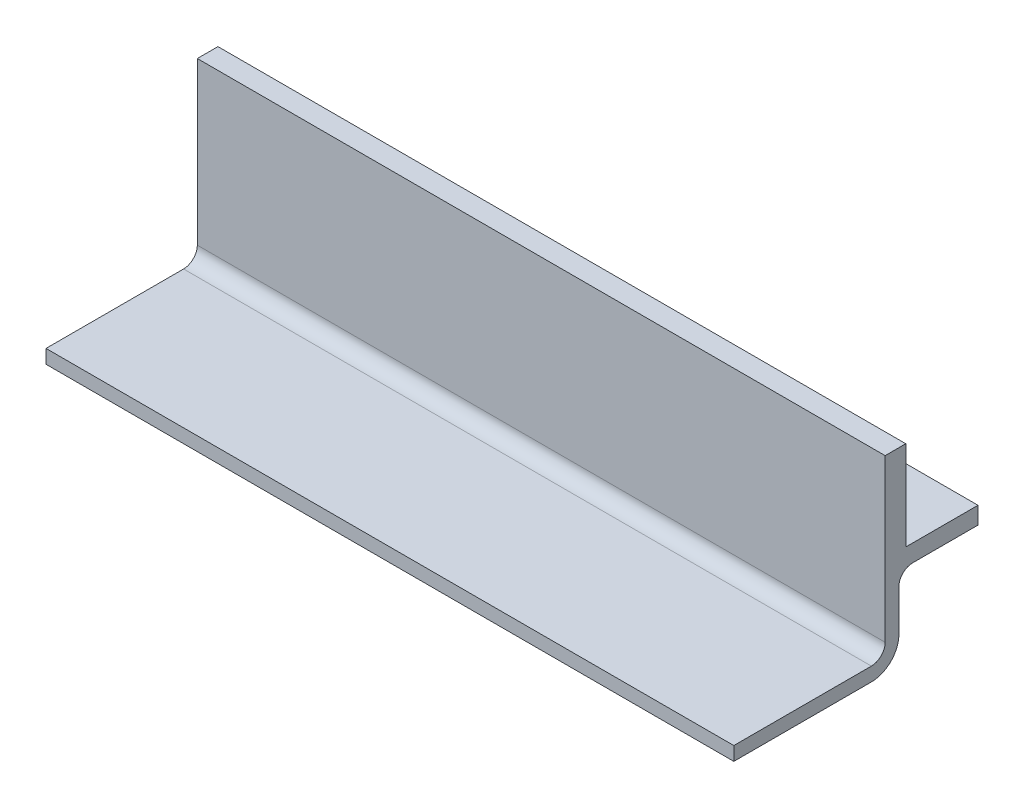
ISO-10303-21;
HEADER;
FILE_DESCRIPTION(('STEP AP214'),'2;1');
FILE_NAME('part.step','',(''),(''),'','','');
FILE_SCHEMA(('AUTOMOTIVE_DESIGN { 1 0 10303 214 1 1 1 1 }'));
ENDSEC;
DATA;
#1=APPLICATION_CONTEXT('core data for automotive mechanical design processes');
#2=APPLICATION_PROTOCOL_DEFINITION('international standard','automotive_design',2000,#1);
#3=PRODUCT_CONTEXT('',#1,'mechanical');
#4=PRODUCT('Part','Part','',(#3));
#5=PRODUCT_RELATED_PRODUCT_CATEGORY('part','',(#4));
#6=PRODUCT_DEFINITION_FORMATION('','',#4);
#7=PRODUCT_DEFINITION_CONTEXT('part definition',#1,'design');
#8=PRODUCT_DEFINITION('design','',#6,#7);
#9=PRODUCT_DEFINITION_SHAPE('','',#8);
#10=(LENGTH_UNIT() NAMED_UNIT(*) SI_UNIT(.MILLI.,.METRE.));
#11=(NAMED_UNIT(*) PLANE_ANGLE_UNIT() SI_UNIT($,.RADIAN.));
#12=(NAMED_UNIT(*) SI_UNIT($,.STERADIAN.) SOLID_ANGLE_UNIT());
#13=UNCERTAINTY_MEASURE_WITH_UNIT(LENGTH_MEASURE(1.E-05),#10,'distance_accuracy_value','');
#14=(GEOMETRIC_REPRESENTATION_CONTEXT(3) GLOBAL_UNCERTAINTY_ASSIGNED_CONTEXT((#13)) GLOBAL_UNIT_ASSIGNED_CONTEXT((#10,
#11,#12)) REPRESENTATION_CONTEXT('',''));
#15=CARTESIAN_POINT('',(0.,0.,0.));
#16=DIRECTION('',(0.,0.,1.));
#17=DIRECTION('',(1.,0.,0.));
#18=AXIS2_PLACEMENT_3D('',#15,#16,#17);
#19=CARTESIAN_POINT('',(100.,-17.2500001862645,16.7500000745058));
#20=DIRECTION('',(1.,0.,0.));
#21=DIRECTION('',(0.,1.,0.));
#22=AXIS2_PLACEMENT_3D('',#19,#20,#21);
#23=PLANE('',#22);
#24=CARTESIAN_POINT('',(100.,-33.0000003725291,25.5));
#25=DIRECTION('',(-1.,0.,0.));
#26=DIRECTION('',(0.,-0.707106781186547,-0.707106781186548));
#27=AXIS2_PLACEMENT_3D('',#24,#25,#26);
#28=CIRCLE('',#27,4.);
#29=CARTESIAN_POINT('',(100.,-33.000000372529,21.5));
#30=VERTEX_POINT('',#29);
#31=CARTESIAN_POINT('',(100.,-37.0000003725291,25.5));
#32=VERTEX_POINT('',#31);
#33=EDGE_CURVE('E188',#30,#32,#28,.T.);
#34=ORIENTED_EDGE('',*,*,#33,.F.);
#35=DIRECTION('',(0.,1.,0.));
#36=VECTOR('',#35,1.);
#37=CARTESIAN_POINT('',(100.,-37.0000003725291,21.5));
#38=LINE('',#37,#36);
#39=CARTESIAN_POINT('',(100.,-27.0000003725291,21.5));
#40=VERTEX_POINT('',#39);
#41=EDGE_CURVE('E183',#30,#40,#38,.T.);
#42=ORIENTED_EDGE('',*,*,#41,.T.);
#43=CARTESIAN_POINT('',(100.,-27.000000372529,19.5));
#44=DIRECTION('',(1.,0.,0.));
#45=DIRECTION('',(0.,0.707106781186546,0.707106781186549));
#46=AXIS2_PLACEMENT_3D('',#43,#44,#45);
#47=CIRCLE('',#46,2.);
#48=CARTESIAN_POINT('',(100.,-25.000000372529,19.5));
#49=VERTEX_POINT('',#48);
#50=EDGE_CURVE('E272',#49,#40,#47,.T.);
#51=ORIENTED_EDGE('',*,*,#50,.F.);
#52=DIRECTION('',(0.,0.,1.));
#53=VECTOR('',#52,1.);
#54=CARTESIAN_POINT('',(100.,-25.000000372529,10.0000001490116));
#55=LINE('',#54,#53);
#56=CARTESIAN_POINT('',(100.,-25.000000372529,10.0000001490116));
#57=VERTEX_POINT('',#56);
#58=EDGE_CURVE('E326',#57,#49,#55,.T.);
#59=ORIENTED_EDGE('',*,*,#58,.F.);
#60=DIRECTION('',(0.,-1.,0.));
#61=VECTOR('',#60,1.);
#62=CARTESIAN_POINT('',(100.,-22.5000000061548,10.0000001490116));
#63=LINE('',#62,#61);
#64=CARTESIAN_POINT('',(100.,-22.5000000061548,10.0000001490116));
#65=VERTEX_POINT('',#64);
#66=EDGE_CURVE('E260',#65,#57,#63,.T.);
#67=ORIENTED_EDGE('',*,*,#66,.F.);
#68=DIRECTION('',(0.,0.,1.));
#69=VECTOR('',#68,1.);
#70=CARTESIAN_POINT('',(100.,-22.5000000061548,10.0000001490116));
#71=LINE('',#70,#69);
#72=CARTESIAN_POINT('',(100.,-22.5000000061547,20.5));
#73=VERTEX_POINT('',#72);
#74=EDGE_CURVE('E346',#65,#73,#71,.T.);
#75=ORIENTED_EDGE('',*,*,#74,.T.);
#76=DIRECTION('',(0.,-1.,0.));
#77=VECTOR('',#76,1.);
#78=CARTESIAN_POINT('',(100.,-16.5000000707805,20.5));
#79=LINE('',#78,#77);
#80=CARTESIAN_POINT('',(100.,-9.5,20.5));
#81=VERTEX_POINT('',#80);
#82=EDGE_CURVE('E25',#81,#73,#79,.T.);
#83=ORIENTED_EDGE('',*,*,#82,.F.);
#84=DIRECTION('',(0.,0.,-1.));
#85=VECTOR('',#84,1.);
#86=CARTESIAN_POINT('',(100.,-9.5,23.5));
#87=LINE('',#86,#85);
#88=CARTESIAN_POINT('',(100.,-9.5,23.5));
#89=VERTEX_POINT('',#88);
#90=EDGE_CURVE('E11',#89,#81,#87,.T.);
#91=ORIENTED_EDGE('',*,*,#90,.F.);
#92=DIRECTION('',(0.,1.,0.));
#93=VECTOR('',#92,1.);
#94=CARTESIAN_POINT('',(100.,-25.000000372529,23.5));
#95=LINE('',#94,#93);
#96=CARTESIAN_POINT('',(100.,-33.0000003725291,23.5));
#97=VERTEX_POINT('',#96);
#98=EDGE_CURVE('E265',#97,#89,#95,.T.);
#99=ORIENTED_EDGE('',*,*,#98,.F.);
#100=CARTESIAN_POINT('',(100.,-33.0000003725291,25.5));
#101=DIRECTION('',(1.,0.,0.));
#102=DIRECTION('',(0.,-0.707106781186549,-0.707106781186546));
#103=AXIS2_PLACEMENT_3D('',#100,#101,#102);
#104=CIRCLE('',#103,2.);
#105=CARTESIAN_POINT('',(100.,-35.0000003725291,25.5));
#106=VERTEX_POINT('',#105);
#107=EDGE_CURVE('E288',#106,#97,#104,.T.);
#108=ORIENTED_EDGE('',*,*,#107,.F.);
#109=DIRECTION('',(0.,0.,1.));
#110=VECTOR('',#109,1.);
#111=CARTESIAN_POINT('',(100.,-35.0000003725291,23.5));
#112=LINE('',#111,#110);
#113=CARTESIAN_POINT('',(100.,-35.000000372529,45.5));
#114=VERTEX_POINT('',#113);
#115=EDGE_CURVE('E216',#106,#114,#112,.T.);
#116=ORIENTED_EDGE('',*,*,#115,.T.);
#117=DIRECTION('',(0.,-1.,0.));
#118=VECTOR('',#117,1.);
#119=CARTESIAN_POINT('',(100.,-35.000000372529,45.5));
#120=LINE('',#119,#118);
#121=CARTESIAN_POINT('',(100.,-37.000000372529,45.5));
#122=VERTEX_POINT('',#121);
#123=EDGE_CURVE('E213',#114,#122,#120,.T.);
#124=ORIENTED_EDGE('',*,*,#123,.T.);
#125=DIRECTION('',(0.,0.,-1.));
#126=VECTOR('',#125,1.);
#127=CARTESIAN_POINT('',(100.,-37.000000372529,45.5));
#128=LINE('',#127,#126);
#129=EDGE_CURVE('E178',#122,#32,#128,.T.);
#130=ORIENTED_EDGE('',*,*,#129,.T.);
#131=EDGE_LOOP('',(#34,#42,#51,#59,#67,#75,#83,#91,#99,#108,#116,#124,#130));
#132=FACE_BOUND('',#131,.T.);
#133=ADVANCED_FACE('F17',(#132),#23,.T.);
#134=CARTESIAN_POINT('',(100.,-9.5,23.5));
#135=DIRECTION('',(0.,1.,0.));
#136=DIRECTION('',(1.,0.,0.));
#137=AXIS2_PLACEMENT_3D('',#134,#135,#136);
#138=PLANE('',#137);
#139=DIRECTION('',(0.,0.,1.));
#140=VECTOR('',#139,1.);
#141=CARTESIAN_POINT('',(0.,-9.5,20.1250000372529));
#142=LINE('',#141,#140);
#143=CARTESIAN_POINT('',(0.,-9.5,20.5));
#144=VERTEX_POINT('',#143);
#145=CARTESIAN_POINT('',(0.,-9.5,23.5));
#146=VERTEX_POINT('',#145);
#147=EDGE_CURVE('E223',#144,#146,#142,.T.);
#148=ORIENTED_EDGE('',*,*,#147,.T.);
#149=DIRECTION('',(-1.,0.,0.));
#150=VECTOR('',#149,1.);
#151=CARTESIAN_POINT('',(100.,-9.5,23.5));
#152=LINE('',#151,#150);
#153=EDGE_CURVE('E303',#89,#146,#152,.T.);
#154=ORIENTED_EDGE('',*,*,#153,.F.);
#155=ORIENTED_EDGE('',*,*,#90,.T.);
#156=DIRECTION('',(-1.,0.,0.));
#157=VECTOR('',#156,1.);
#158=CARTESIAN_POINT('',(100.,-9.5,20.5));
#159=LINE('',#158,#157);
#160=EDGE_CURVE('E282',#81,#144,#159,.T.);
#161=ORIENTED_EDGE('',*,*,#160,.T.);
#162=EDGE_LOOP('',(#148,#154,#155,#161));
#163=FACE_BOUND('',#162,.T.);
#164=ADVANCED_FACE('F366',(#163),#138,.T.);
#165=CARTESIAN_POINT('',(100.,-9.5,20.5));
#166=DIRECTION('',(0.,0.,-1.));
#167=DIRECTION('',(-1.,0.,0.));
#168=AXIS2_PLACEMENT_3D('',#165,#166,#167);
#169=PLANE('',#168);
#170=DIRECTION('',(0.,1.,0.));
#171=VECTOR('',#170,1.);
#172=CARTESIAN_POINT('',(0.,-13.3750000931323,20.5));
#173=LINE('',#172,#171);
#174=CARTESIAN_POINT('',(0.,-22.5000000061547,20.5));
#175=VERTEX_POINT('',#174);
#176=EDGE_CURVE('E240',#175,#144,#173,.T.);
#177=ORIENTED_EDGE('',*,*,#176,.T.);
#178=ORIENTED_EDGE('',*,*,#160,.F.);
#179=ORIENTED_EDGE('',*,*,#82,.T.);
#180=DIRECTION('',(-1.,0.,0.));
#181=VECTOR('',#180,1.);
#182=CARTESIAN_POINT('',(100.,-22.5000000061547,20.5));
#183=LINE('',#182,#181);
#184=EDGE_CURVE('E306',#73,#175,#183,.T.);
#185=ORIENTED_EDGE('',*,*,#184,.T.);
#186=EDGE_LOOP('',(#177,#178,#179,#185));
#187=FACE_BOUND('',#186,.T.);
#188=ADVANCED_FACE('F362',(#187),#169,.T.);
#189=CARTESIAN_POINT('',(100.,-22.5000000061547,20.5));
#190=DIRECTION('',(0.,1.,0.));
#191=DIRECTION('',(0.,0.,-1.));
#192=AXIS2_PLACEMENT_3D('',#189,#190,#191);
#193=PLANE('',#192);
#194=CARTESIAN_POINT('',(85.,-22.5000000061547,14.5000000461613));
#195=DIRECTION('',(0.,-1.,0.));
#196=DIRECTION('',(1.,0.,0.));
#197=AXIS2_PLACEMENT_3D('',#194,#195,#196);
#198=CIRCLE('',#197,2.);
#199=CARTESIAN_POINT('',(83.,-22.5000000061548,14.5000000461613));
#200=VERTEX_POINT('',#199);
#201=EDGE_CURVE('E299',#200,#200,#198,.T.);
#202=ORIENTED_EDGE('',*,*,#201,.T.);
#203=EDGE_LOOP('',(#202));
#204=FACE_BOUND('',#203,.T.);
#205=CARTESIAN_POINT('',(15.,-22.5000000061547,14.5000000461613));
#206=DIRECTION('',(0.,-1.,0.));
#207=DIRECTION('',(1.,0.,0.));
#208=AXIS2_PLACEMENT_3D('',#205,#206,#207);
#209=CIRCLE('',#208,2.);
#210=CARTESIAN_POINT('',(13.,-22.5000000061548,14.5000000461613));
#211=VERTEX_POINT('',#210);
#212=EDGE_CURVE('E227',#211,#211,#209,.T.);
#213=ORIENTED_EDGE('',*,*,#212,.T.);
#214=EDGE_LOOP('',(#213));
#215=FACE_BOUND('',#214,.T.);
#216=DIRECTION('',(0.,0.,1.));
#217=VECTOR('',#216,1.);
#218=CARTESIAN_POINT('',(0.,-22.5000000061547,18.6250000372529));
#219=LINE('',#218,#217);
#220=CARTESIAN_POINT('',(0.,-22.5000000061548,10.0000001490116));
#221=VERTEX_POINT('',#220);
#222=EDGE_CURVE('E246',#221,#175,#219,.T.);
#223=ORIENTED_EDGE('',*,*,#222,.T.);
#224=ORIENTED_EDGE('',*,*,#184,.F.);
#225=ORIENTED_EDGE('',*,*,#74,.F.);
#226=DIRECTION('',(-1.,0.,0.));
#227=VECTOR('',#226,1.);
#228=CARTESIAN_POINT('',(100.,-22.5000000061548,10.0000001490116));
#229=LINE('',#228,#227);
#230=EDGE_CURVE('E230',#65,#221,#229,.T.);
#231=ORIENTED_EDGE('',*,*,#230,.T.);
#232=EDGE_LOOP('',(#223,#224,#225,#231));
#233=FACE_BOUND('',#232,.T.);
#234=ADVANCED_FACE('F359',(#204,#215,#233),#193,.T.);
#235=CARTESIAN_POINT('',(100.,-22.5000000061548,10.0000001490116));
#236=DIRECTION('',(0.,0.,-1.));
#237=DIRECTION('',(-1.,0.,0.));
#238=AXIS2_PLACEMENT_3D('',#235,#236,#237);
#239=PLANE('',#238);
#240=DIRECTION('',(0.,1.,0.));
#241=VECTOR('',#240,1.);
#242=CARTESIAN_POINT('',(0.,-19.8750000962097,10.0000001490116));
#243=LINE('',#242,#241);
#244=CARTESIAN_POINT('',(0.,-25.000000372529,10.0000001490116));
#245=VERTEX_POINT('',#244);
#246=EDGE_CURVE('E241',#245,#221,#243,.T.);
#247=ORIENTED_EDGE('',*,*,#246,.T.);
#248=ORIENTED_EDGE('',*,*,#230,.F.);
#249=ORIENTED_EDGE('',*,*,#66,.T.);
#250=DIRECTION('',(-1.,0.,0.));
#251=VECTOR('',#250,1.);
#252=CARTESIAN_POINT('',(100.,-25.000000372529,10.0000001490116));
#253=LINE('',#252,#251);
#254=EDGE_CURVE('E323',#57,#245,#253,.T.);
#255=ORIENTED_EDGE('',*,*,#254,.T.);
#256=EDGE_LOOP('',(#247,#248,#249,#255));
#257=FACE_BOUND('',#256,.T.);
#258=ADVANCED_FACE('F534',(#257),#239,.T.);
#259=CARTESIAN_POINT('',(15.,-25.000000372529,14.5000000461613));
#260=DIRECTION('',(0.,1.,0.));
#261=DIRECTION('',(1.,0.,0.));
#262=AXIS2_PLACEMENT_3D('',#259,#260,#261);
#263=CYLINDRICAL_SURFACE('',#262,2.);
#264=CARTESIAN_POINT('',(15.,-23.700000372529,14.5000000461613));
#265=DIRECTION('',(0.,1.,0.));
#266=DIRECTION('',(1.,0.,0.));
#267=AXIS2_PLACEMENT_3D('',#264,#265,#266);
#268=CIRCLE('',#267,2.);
#269=CARTESIAN_POINT('',(13.,-23.700000372529,14.5000000461613));
#270=VERTEX_POINT('',#269);
#271=EDGE_CURVE('E298',#270,#270,#268,.T.);
#272=ORIENTED_EDGE('',*,*,#271,.F.);
#273=DIRECTION('',(0.,1.,0.));
#274=VECTOR('',#273,1.);
#275=CARTESIAN_POINT('',(13.,-25.000000372529,14.5000000461613));
#276=LINE('',#275,#274);
#277=EDGE_CURVE('E231',#270,#211,#276,.T.);
#278=ORIENTED_EDGE('',*,*,#277,.T.);
#279=ORIENTED_EDGE('',*,*,#212,.F.);
#280=ORIENTED_EDGE('',*,*,#277,.F.);
#281=EDGE_LOOP('',(#272,#278,#279,#280));
#282=FACE_BOUND('',#281,.T.);
#283=ADVANCED_FACE('F528',(#282),#263,.F.);
#284=CARTESIAN_POINT('',(15.,-24.350000372529,14.5000000461613));
#285=DIRECTION('',(0.,-1.,0.));
#286=DIRECTION('',(1.,0.,0.));
#287=AXIS2_PLACEMENT_3D('',#284,#285,#286);
#288=CONICAL_SURFACE('',#287,2.65,0.785398163397446);
#289=CARTESIAN_POINT('',(15.,-25.000000372529,14.5000000461613));
#290=DIRECTION('',(0.,-1.,0.));
#291=DIRECTION('',(1.,0.,0.));
#292=AXIS2_PLACEMENT_3D('',#289,#290,#291);
#293=CIRCLE('',#292,3.3);
#294=CARTESIAN_POINT('',(11.7,-25.000000372529,14.5000000461613));
#295=VERTEX_POINT('',#294);
#296=EDGE_CURVE('E329',#295,#295,#293,.T.);
#297=ORIENTED_EDGE('',*,*,#296,.T.);
#298=DIRECTION('',(0.707106781186546,0.707106781186549,0.));
#299=VECTOR('',#298,1.);
#300=CARTESIAN_POINT('',(12.35,-24.350000372529,14.5000000461613));
#301=LINE('',#300,#299);
#302=EDGE_CURVE('E294',#295,#270,#301,.T.);
#303=ORIENTED_EDGE('',*,*,#302,.T.);
#304=ORIENTED_EDGE('',*,*,#271,.T.);
#305=ORIENTED_EDGE('',*,*,#302,.F.);
#306=EDGE_LOOP('',(#297,#303,#304,#305));
#307=FACE_BOUND('',#306,.T.);
#308=ADVANCED_FACE('F533',(#307),#288,.F.);
#309=CARTESIAN_POINT('',(85.,-25.000000372529,14.5000000461613));
#310=DIRECTION('',(0.,1.,0.));
#311=DIRECTION('',(1.,0.,0.));
#312=AXIS2_PLACEMENT_3D('',#309,#310,#311);
#313=CYLINDRICAL_SURFACE('',#312,2.);
#314=CARTESIAN_POINT('',(85.,-23.700000372529,14.5000000461613));
#315=DIRECTION('',(0.,1.,0.));
#316=DIRECTION('',(1.,0.,0.));
#317=AXIS2_PLACEMENT_3D('',#314,#315,#316);
#318=CIRCLE('',#317,2.);
#319=CARTESIAN_POINT('',(83.,-23.700000372529,14.5000000461613));
#320=VERTEX_POINT('',#319);
#321=EDGE_CURVE('E319',#320,#320,#318,.T.);
#322=ORIENTED_EDGE('',*,*,#321,.F.);
#323=DIRECTION('',(0.,1.,0.));
#324=VECTOR('',#323,1.);
#325=CARTESIAN_POINT('',(83.,-25.000000372529,14.5000000461613));
#326=LINE('',#325,#324);
#327=EDGE_CURVE('E333',#320,#200,#326,.T.);
#328=ORIENTED_EDGE('',*,*,#327,.T.);
#329=ORIENTED_EDGE('',*,*,#201,.F.);
#330=ORIENTED_EDGE('',*,*,#327,.F.);
#331=EDGE_LOOP('',(#322,#328,#329,#330));
#332=FACE_BOUND('',#331,.T.);
#333=ADVANCED_FACE('F610',(#332),#313,.F.);
#334=CARTESIAN_POINT('',(100.,-25.000000372529,10.0000001490116));
#335=DIRECTION('',(0.,-1.,0.));
#336=DIRECTION('',(0.,0.,-1.));
#337=AXIS2_PLACEMENT_3D('',#334,#335,#336);
#338=PLANE('',#337);
#339=CARTESIAN_POINT('',(85.,-25.000000372529,14.5000000461613));
#340=DIRECTION('',(0.,-1.,0.));
#341=DIRECTION('',(1.,0.,0.));
#342=AXIS2_PLACEMENT_3D('',#339,#340,#341);
#343=CIRCLE('',#342,3.3);
#344=CARTESIAN_POINT('',(81.7,-25.000000372529,14.5000000461613));
#345=VERTEX_POINT('',#344);
#346=EDGE_CURVE('E215',#345,#345,#343,.T.);
#347=ORIENTED_EDGE('',*,*,#346,.F.);
#348=EDGE_LOOP('',(#347));
#349=FACE_BOUND('',#348,.T.);
#350=ORIENTED_EDGE('',*,*,#296,.F.);
#351=EDGE_LOOP('',(#350));
#352=FACE_BOUND('',#351,.T.);
#353=DIRECTION('',(1.,0.,0.));
#354=VECTOR('',#353,1.);
#355=CARTESIAN_POINT('',(100.,-25.000000372529,19.5));
#356=LINE('',#355,#354);
#357=CARTESIAN_POINT('',(0.,-25.000000372529,19.5));
#358=VERTEX_POINT('',#357);
#359=EDGE_CURVE('E279',#358,#49,#356,.T.);
#360=ORIENTED_EDGE('',*,*,#359,.F.);
#361=DIRECTION('',(0.,0.,-1.));
#362=VECTOR('',#361,1.);
#363=CARTESIAN_POINT('',(0.,-25.000000372529,13.3750001117587));
#364=LINE('',#363,#362);
#365=EDGE_CURVE('E245',#358,#245,#364,.T.);
#366=ORIENTED_EDGE('',*,*,#365,.T.);
#367=ORIENTED_EDGE('',*,*,#254,.F.);
#368=ORIENTED_EDGE('',*,*,#58,.T.);
#369=EDGE_LOOP('',(#360,#366,#367,#368));
#370=FACE_BOUND('',#369,.T.);
#371=ADVANCED_FACE('F604',(#349,#352,#370),#338,.T.);
#372=CARTESIAN_POINT('',(85.,-24.350000372529,14.5000000461613));
#373=DIRECTION('',(0.,-1.,0.));
#374=DIRECTION('',(1.,0.,0.));
#375=AXIS2_PLACEMENT_3D('',#372,#373,#374);
#376=CONICAL_SURFACE('',#375,2.65,0.785398163397448);
#377=ORIENTED_EDGE('',*,*,#346,.T.);
#378=DIRECTION('',(0.707106781186548,0.707106781186548,0.));
#379=VECTOR('',#378,1.);
#380=CARTESIAN_POINT('',(82.35,-24.350000372529,14.5000000461613));
#381=LINE('',#380,#379);
#382=EDGE_CURVE('E315',#345,#320,#381,.T.);
#383=ORIENTED_EDGE('',*,*,#382,.T.);
#384=ORIENTED_EDGE('',*,*,#321,.T.);
#385=ORIENTED_EDGE('',*,*,#382,.F.);
#386=EDGE_LOOP('',(#377,#383,#384,#385));
#387=FACE_BOUND('',#386,.T.);
#388=ADVANCED_FACE('F609',(#387),#376,.F.);
#389=CARTESIAN_POINT('',(100.,-37.000000372529,45.5));
#390=DIRECTION('',(0.,0.,1.));
#391=DIRECTION('',(0.,-1.,0.));
#392=AXIS2_PLACEMENT_3D('',#389,#390,#391);
#393=PLANE('',#392);
#394=ORIENTED_EDGE('',*,*,#123,.F.);
#395=DIRECTION('',(-1.,0.,0.));
#396=VECTOR('',#395,1.);
#397=CARTESIAN_POINT('',(100.,-35.000000372529,45.5));
#398=LINE('',#397,#396);
#399=CARTESIAN_POINT('',(0.,-35.000000372529,45.5));
#400=VERTEX_POINT('',#399);
#401=EDGE_CURVE('E201',#114,#400,#398,.T.);
#402=ORIENTED_EDGE('',*,*,#401,.T.);
#403=DIRECTION('',(0.,1.,0.));
#404=VECTOR('',#403,1.);
#405=CARTESIAN_POINT('',(0.,-35.000000372529,45.5));
#406=LINE('',#405,#404);
#407=CARTESIAN_POINT('',(0.,-37.000000372529,45.5));
#408=VERTEX_POINT('',#407);
#409=EDGE_CURVE('E212',#408,#400,#406,.T.);
#410=ORIENTED_EDGE('',*,*,#409,.F.);
#411=DIRECTION('',(-1.,0.,0.));
#412=VECTOR('',#411,1.);
#413=CARTESIAN_POINT('',(100.,-37.000000372529,45.5));
#414=LINE('',#413,#412);
#415=EDGE_CURVE('E269',#122,#408,#414,.T.);
#416=ORIENTED_EDGE('',*,*,#415,.F.);
#417=EDGE_LOOP('',(#394,#402,#410,#416));
#418=FACE_BOUND('',#417,.T.);
#419=ADVANCED_FACE('F577',(#418),#393,.T.);
#420=CARTESIAN_POINT('',(100.,-35.000000372529,45.5));
#421=DIRECTION('',(0.,1.,0.));
#422=DIRECTION('',(0.,0.,-1.));
#423=AXIS2_PLACEMENT_3D('',#420,#421,#422);
#424=PLANE('',#423);
#425=DIRECTION('',(1.,0.,0.));
#426=VECTOR('',#425,1.);
#427=CARTESIAN_POINT('',(100.,-35.0000003725291,25.5));
#428=LINE('',#427,#426);
#429=CARTESIAN_POINT('',(0.,-35.0000003725291,25.5));
#430=VERTEX_POINT('',#429);
#431=EDGE_CURVE('E261',#430,#106,#428,.T.);
#432=ORIENTED_EDGE('',*,*,#431,.F.);
#433=DIRECTION('',(0.,0.,-1.));
#434=VECTOR('',#433,1.);
#435=CARTESIAN_POINT('',(0.,-35.0000003725291,23.5));
#436=LINE('',#435,#434);
#437=EDGE_CURVE('E208',#400,#430,#436,.T.);
#438=ORIENTED_EDGE('',*,*,#437,.F.);
#439=ORIENTED_EDGE('',*,*,#401,.F.);
#440=ORIENTED_EDGE('',*,*,#115,.F.);
#441=EDGE_LOOP('',(#432,#438,#439,#440));
#442=FACE_BOUND('',#441,.T.);
#443=ADVANCED_FACE('F376',(#442),#424,.T.);
#444=CARTESIAN_POINT('',(100.,-25.000000372529,23.5));
#445=DIRECTION('',(0.,0.,1.));
#446=DIRECTION('',(0.,-1.,0.));
#447=AXIS2_PLACEMENT_3D('',#444,#445,#446);
#448=PLANE('',#447);
#449=DIRECTION('',(-1.,0.,0.));
#450=VECTOR('',#449,1.);
#451=CARTESIAN_POINT('',(100.,-33.0000003725291,23.5));
#452=LINE('',#451,#450);
#453=CARTESIAN_POINT('',(0.,-33.0000003725291,23.5));
#454=VERTEX_POINT('',#453);
#455=EDGE_CURVE('E266',#97,#454,#452,.T.);
#456=ORIENTED_EDGE('',*,*,#455,.F.);
#457=ORIENTED_EDGE('',*,*,#98,.T.);
#458=ORIENTED_EDGE('',*,*,#153,.T.);
#459=DIRECTION('',(0.,-1.,0.));
#460=VECTOR('',#459,1.);
#461=CARTESIAN_POINT('',(0.,-21.1250002793968,23.5));
#462=LINE('',#461,#460);
#463=EDGE_CURVE('E207',#146,#454,#462,.T.);
#464=ORIENTED_EDGE('',*,*,#463,.T.);
#465=EDGE_LOOP('',(#456,#457,#458,#464));
#466=FACE_BOUND('',#465,.T.);
#467=ADVANCED_FACE('F369',(#466),#448,.T.);
#468=CARTESIAN_POINT('',(100.,-33.0000003725291,25.5));
#469=DIRECTION('',(-1.,0.,0.));
#470=DIRECTION('',(0.,-0.707106781186549,-0.707106781186546));
#471=AXIS2_PLACEMENT_3D('',#468,#469,#470);
#472=CYLINDRICAL_SURFACE('',#471,2.);
#473=ORIENTED_EDGE('',*,*,#107,.T.);
#474=ORIENTED_EDGE('',*,*,#455,.T.);
#475=CARTESIAN_POINT('',(0.,-33.0000003725291,25.5));
#476=DIRECTION('',(-1.,0.,0.));
#477=DIRECTION('',(0.,-0.707106781186549,-0.707106781186546));
#478=AXIS2_PLACEMENT_3D('',#475,#476,#477);
#479=CIRCLE('',#478,2.);
#480=EDGE_CURVE('E203',#454,#430,#479,.T.);
#481=ORIENTED_EDGE('',*,*,#480,.T.);
#482=ORIENTED_EDGE('',*,*,#431,.T.);
#483=EDGE_LOOP('',(#473,#474,#481,#482));
#484=FACE_BOUND('',#483,.T.);
#485=ADVANCED_FACE('F373',(#484),#472,.F.);
#486=CARTESIAN_POINT('',(100.,-25.000000372529,21.5));
#487=DIRECTION('',(0.,0.,-1.));
#488=DIRECTION('',(-1.,0.,0.));
#489=AXIS2_PLACEMENT_3D('',#486,#487,#488);
#490=PLANE('',#489);
#491=DIRECTION('',(1.,0.,0.));
#492=VECTOR('',#491,1.);
#493=CARTESIAN_POINT('',(100.,-33.000000372529,21.5));
#494=LINE('',#493,#492);
#495=CARTESIAN_POINT('',(0.,-33.000000372529,21.5));
#496=VERTEX_POINT('',#495);
#497=EDGE_CURVE('E181',#496,#30,#494,.T.);
#498=ORIENTED_EDGE('',*,*,#497,.F.);
#499=DIRECTION('',(0.,-1.,0.));
#500=VECTOR('',#499,1.);
#501=CARTESIAN_POINT('',(0.,-37.0000003725291,21.5));
#502=LINE('',#501,#500);
#503=CARTESIAN_POINT('',(0.,-27.0000003725291,21.5));
#504=VERTEX_POINT('',#503);
#505=EDGE_CURVE('E166',#504,#496,#502,.T.);
#506=ORIENTED_EDGE('',*,*,#505,.F.);
#507=DIRECTION('',(-1.,0.,0.));
#508=VECTOR('',#507,1.);
#509=CARTESIAN_POINT('',(100.,-27.0000003725291,21.5));
#510=LINE('',#509,#508);
#511=EDGE_CURVE('E276',#40,#504,#510,.T.);
#512=ORIENTED_EDGE('',*,*,#511,.F.);
#513=ORIENTED_EDGE('',*,*,#41,.F.);
#514=EDGE_LOOP('',(#498,#506,#512,#513));
#515=FACE_BOUND('',#514,.T.);
#516=ADVANCED_FACE('F182',(#515),#490,.T.);
#517=CARTESIAN_POINT('',(100.,-27.000000372529,19.5));
#518=DIRECTION('',(-1.,0.,0.));
#519=DIRECTION('',(0.,0.707106781186546,0.707106781186549));
#520=AXIS2_PLACEMENT_3D('',#517,#518,#519);
#521=CYLINDRICAL_SURFACE('',#520,2.);
#522=ORIENTED_EDGE('',*,*,#50,.T.);
#523=ORIENTED_EDGE('',*,*,#511,.T.);
#524=CARTESIAN_POINT('',(0.,-27.000000372529,19.5));
#525=DIRECTION('',(-1.,0.,0.));
#526=DIRECTION('',(0.,0.707106781186546,0.707106781186549));
#527=AXIS2_PLACEMENT_3D('',#524,#525,#526);
#528=CIRCLE('',#527,2.);
#529=EDGE_CURVE('E174',#504,#358,#528,.T.);
#530=ORIENTED_EDGE('',*,*,#529,.T.);
#531=ORIENTED_EDGE('',*,*,#359,.T.);
#532=EDGE_LOOP('',(#522,#523,#530,#531));
#533=FACE_BOUND('',#532,.T.);
#534=ADVANCED_FACE('F541',(#533),#521,.F.);
#535=CARTESIAN_POINT('',(100.,-37.0000003725291,21.5));
#536=DIRECTION('',(0.,-1.,0.));
#537=DIRECTION('',(-1.,0.,0.));
#538=AXIS2_PLACEMENT_3D('',#535,#536,#537);
#539=PLANE('',#538);
#540=DIRECTION('',(-1.,0.,0.));
#541=VECTOR('',#540,1.);
#542=CARTESIAN_POINT('',(100.,-37.0000003725291,25.5));
#543=LINE('',#542,#541);
#544=CARTESIAN_POINT('',(0.,-37.0000003725291,25.5));
#545=VERTEX_POINT('',#544);
#546=EDGE_CURVE('E193',#32,#545,#543,.T.);
#547=ORIENTED_EDGE('',*,*,#546,.F.);
#548=ORIENTED_EDGE('',*,*,#129,.F.);
#549=ORIENTED_EDGE('',*,*,#415,.T.);
#550=DIRECTION('',(0.,0.,1.));
#551=VECTOR('',#550,1.);
#552=CARTESIAN_POINT('',(0.,-37.000000372529,45.5));
#553=LINE('',#552,#551);
#554=EDGE_CURVE('E226',#545,#408,#553,.T.);
#555=ORIENTED_EDGE('',*,*,#554,.F.);
#556=EDGE_LOOP('',(#547,#548,#549,#555));
#557=FACE_BOUND('',#556,.T.);
#558=ADVANCED_FACE('F546',(#557),#539,.T.);
#559=CARTESIAN_POINT('',(0.,-17.2500001862645,16.7500000745058));
#560=DIRECTION('',(-1.,0.,0.));
#561=DIRECTION('',(0.,0.,1.));
#562=AXIS2_PLACEMENT_3D('',#559,#560,#561);
#563=PLANE('',#562);
#564=CARTESIAN_POINT('',(0.,-33.0000003725291,25.5));
#565=DIRECTION('',(1.,0.,0.));
#566=DIRECTION('',(0.,-0.707106781186547,-0.707106781186548));
#567=AXIS2_PLACEMENT_3D('',#564,#565,#566);
#568=CIRCLE('',#567,4.);
#569=EDGE_CURVE('E171',#545,#496,#568,.T.);
#570=ORIENTED_EDGE('',*,*,#569,.F.);
#571=ORIENTED_EDGE('',*,*,#554,.T.);
#572=ORIENTED_EDGE('',*,*,#409,.T.);
#573=ORIENTED_EDGE('',*,*,#437,.T.);
#574=ORIENTED_EDGE('',*,*,#480,.F.);
#575=ORIENTED_EDGE('',*,*,#463,.F.);
#576=ORIENTED_EDGE('',*,*,#147,.F.);
#577=ORIENTED_EDGE('',*,*,#176,.F.);
#578=ORIENTED_EDGE('',*,*,#222,.F.);
#579=ORIENTED_EDGE('',*,*,#246,.F.);
#580=ORIENTED_EDGE('',*,*,#365,.F.);
#581=ORIENTED_EDGE('',*,*,#529,.F.);
#582=ORIENTED_EDGE('',*,*,#505,.T.);
#583=EDGE_LOOP('',(#570,#571,#572,#573,#574,#575,#576,#577,#578,#579,#580,#581,#582));
#584=FACE_BOUND('',#583,.T.);
#585=ADVANCED_FACE('F168',(#584),#563,.T.);
#586=CARTESIAN_POINT('',(100.,-33.0000003725291,25.5));
#587=DIRECTION('',(-1.,0.,0.));
#588=DIRECTION('',(0.,-0.707106781186547,-0.707106781186548));
#589=AXIS2_PLACEMENT_3D('',#586,#587,#588);
#590=CYLINDRICAL_SURFACE('',#589,4.);
#591=ORIENTED_EDGE('',*,*,#569,.T.);
#592=ORIENTED_EDGE('',*,*,#497,.T.);
#593=ORIENTED_EDGE('',*,*,#33,.T.);
#594=ORIENTED_EDGE('',*,*,#546,.T.);
#595=EDGE_LOOP('',(#591,#592,#593,#594));
#596=FACE_BOUND('',#595,.T.);
#597=ADVANCED_FACE('F191',(#596),#590,.T.);
#598=CLOSED_SHELL('',(#133,#164,#188,#234,#258,#283,#308,#333,#371,#388,#419,#443,#467,#485,
#516,#534,#558,#585,#597));
#599=MANIFOLD_SOLID_BREP('B1',#598);
#600=ADVANCED_BREP_SHAPE_REPRESENTATION('',(#18,#599),#14);
#601=SHAPE_DEFINITION_REPRESENTATION(#9,#600);
ENDSEC;
END-ISO-10303-21;
